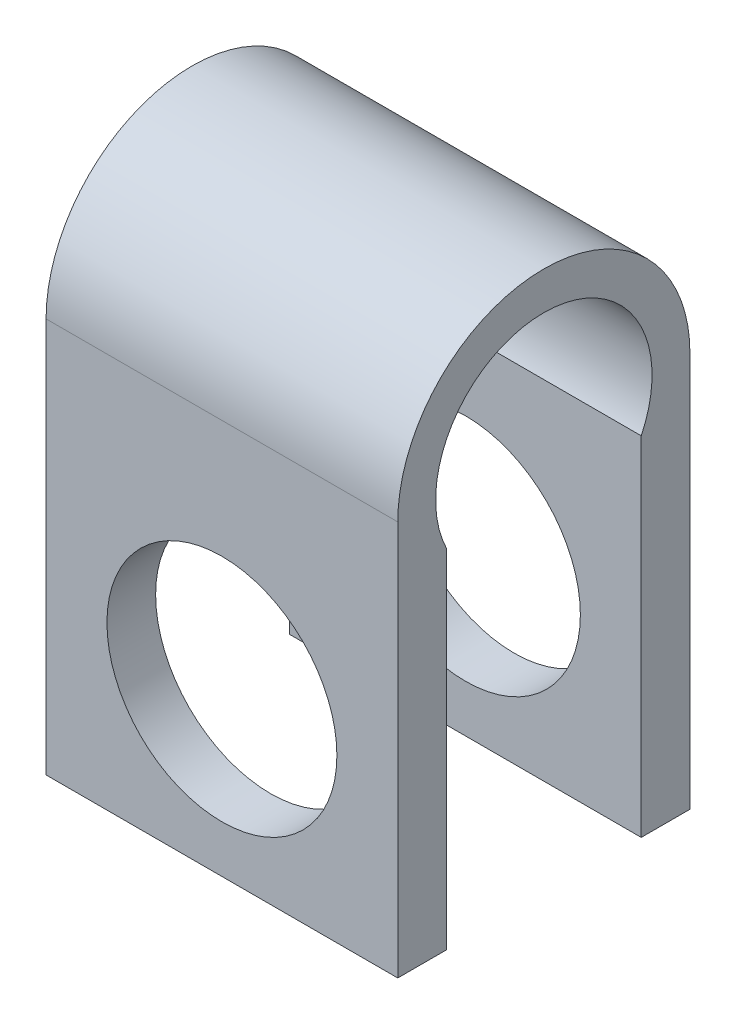
ISO-10303-21;
HEADER;
FILE_DESCRIPTION(('STEP AP214'),'2;1');
FILE_NAME('part.step','',(''),(''),'','','');
FILE_SCHEMA(('AUTOMOTIVE_DESIGN { 1 0 10303 214 1 1 1 1 }'));
ENDSEC;
DATA;
#1=APPLICATION_CONTEXT('core data for automotive mechanical design processes');
#2=APPLICATION_PROTOCOL_DEFINITION('international standard','automotive_design',2000,#1);
#3=PRODUCT_CONTEXT('',#1,'mechanical');
#4=PRODUCT('Part','Part','',(#3));
#5=PRODUCT_RELATED_PRODUCT_CATEGORY('part','',(#4));
#6=PRODUCT_DEFINITION_FORMATION('','',#4);
#7=PRODUCT_DEFINITION_CONTEXT('part definition',#1,'design');
#8=PRODUCT_DEFINITION('design','',#6,#7);
#9=PRODUCT_DEFINITION_SHAPE('','',#8);
#10=(LENGTH_UNIT() NAMED_UNIT(*) SI_UNIT(.MILLI.,.METRE.));
#11=(NAMED_UNIT(*) PLANE_ANGLE_UNIT() SI_UNIT($,.RADIAN.));
#12=(NAMED_UNIT(*) SI_UNIT($,.STERADIAN.) SOLID_ANGLE_UNIT());
#13=UNCERTAINTY_MEASURE_WITH_UNIT(LENGTH_MEASURE(1.E-05),#10,'distance_accuracy_value','');
#14=(GEOMETRIC_REPRESENTATION_CONTEXT(3) GLOBAL_UNCERTAINTY_ASSIGNED_CONTEXT((#13)) GLOBAL_UNIT_ASSIGNED_CONTEXT((#10,
#11,#12)) REPRESENTATION_CONTEXT('',''));
#15=CARTESIAN_POINT('',(0.,0.,0.));
#16=DIRECTION('',(0.,0.,1.));
#17=DIRECTION('',(1.,0.,0.));
#18=AXIS2_PLACEMENT_3D('',#15,#16,#17);
#19=CARTESIAN_POINT('',(13.,0.,0.));
#20=DIRECTION('',(-1.,0.,0.));
#21=DIRECTION('',(0.,0.,1.));
#22=AXIS2_PLACEMENT_3D('',#19,#20,#21);
#23=CYLINDRICAL_SURFACE('',#22,4.);
#24=CARTESIAN_POINT('',(0.,0.,0.));
#25=DIRECTION('',(-1.,0.,0.));
#26=DIRECTION('',(0.,0.,-1.));
#27=AXIS2_PLACEMENT_3D('',#24,#25,#26);
#28=CIRCLE('',#27,4.);
#29=CARTESIAN_POINT('',(0.,-1.74355957741618,3.60000000000004));
#30=VERTEX_POINT('',#29);
#31=CARTESIAN_POINT('',(0.,-1.74355957741618,-3.60000000000004));
#32=VERTEX_POINT('',#31);
#33=EDGE_CURVE('E130',#30,#32,#28,.T.);
#34=ORIENTED_EDGE('',*,*,#33,.T.);
#35=DIRECTION('',(-1.,0.,0.));
#36=VECTOR('',#35,1.);
#37=CARTESIAN_POINT('',(13.,-1.74355957741618,-3.60000000000004));
#38=LINE('',#37,#36);
#39=CARTESIAN_POINT('',(13.,-1.74355957741618,-3.60000000000004));
#40=VERTEX_POINT('',#39);
#41=EDGE_CURVE('E11',#40,#32,#38,.T.);
#42=ORIENTED_EDGE('',*,*,#41,.F.);
#43=CARTESIAN_POINT('',(13.,0.,0.));
#44=DIRECTION('',(-1.,0.,0.));
#45=DIRECTION('',(0.,0.,-1.));
#46=AXIS2_PLACEMENT_3D('',#43,#44,#45);
#47=CIRCLE('',#46,4.);
#48=CARTESIAN_POINT('',(13.,-1.74355957741618,3.60000000000004));
#49=VERTEX_POINT('',#48);
#50=EDGE_CURVE('E145',#49,#40,#47,.T.);
#51=ORIENTED_EDGE('',*,*,#50,.F.);
#52=DIRECTION('',(-1.,0.,0.));
#53=VECTOR('',#52,1.);
#54=CARTESIAN_POINT('',(13.,-1.74355957741618,3.60000000000004));
#55=LINE('',#54,#53);
#56=EDGE_CURVE('E126',#49,#30,#55,.T.);
#57=ORIENTED_EDGE('',*,*,#56,.T.);
#58=EDGE_LOOP('',(#34,#42,#51,#57));
#59=FACE_BOUND('',#58,.T.);
#60=ADVANCED_FACE('F33',(#59),#23,.F.);
#61=CARTESIAN_POINT('',(13.,-14.6,-3.6));
#62=DIRECTION('',(0.,0.,-1.));
#63=DIRECTION('',(0.,1.,0.));
#64=AXIS2_PLACEMENT_3D('',#61,#62,#63);
#65=PLANE('',#64);
#66=CARTESIAN_POINT('',(6.5,-8.59999999999999,-3.60000000000002));
#67=DIRECTION('',(0.,0.,-1.));
#68=DIRECTION('',(0.,1.,0.));
#69=AXIS2_PLACEMENT_3D('',#66,#67,#68);
#70=CIRCLE('',#69,4.25);
#71=CARTESIAN_POINT('',(10.75,-8.59999999999999,-3.60000000000002));
#72=VERTEX_POINT('',#71);
#73=EDGE_CURVE('E134',#72,#72,#70,.T.);
#74=ORIENTED_EDGE('',*,*,#73,.T.);
#75=EDGE_LOOP('',(#74));
#76=FACE_BOUND('',#75,.T.);
#77=DIRECTION('',(0.,-1.,0.));
#78=VECTOR('',#77,1.);
#79=CARTESIAN_POINT('',(0.,-14.6,-3.6));
#80=LINE('',#79,#78);
#81=CARTESIAN_POINT('',(0.,-14.6,-3.6));
#82=VERTEX_POINT('',#81);
#83=EDGE_CURVE('E133',#32,#82,#80,.T.);
#84=ORIENTED_EDGE('',*,*,#83,.T.);
#85=DIRECTION('',(-1.,0.,0.));
#86=VECTOR('',#85,1.);
#87=CARTESIAN_POINT('',(13.,-14.6,-3.6));
#88=LINE('',#87,#86);
#89=CARTESIAN_POINT('',(13.,-14.6,-3.6));
#90=VERTEX_POINT('',#89);
#91=EDGE_CURVE('E42',#90,#82,#88,.T.);
#92=ORIENTED_EDGE('',*,*,#91,.F.);
#93=DIRECTION('',(0.,-1.,0.));
#94=VECTOR('',#93,1.);
#95=CARTESIAN_POINT('',(13.,-14.6,-3.6));
#96=LINE('',#95,#94);
#97=EDGE_CURVE('E93',#40,#90,#96,.T.);
#98=ORIENTED_EDGE('',*,*,#97,.F.);
#99=ORIENTED_EDGE('',*,*,#41,.T.);
#100=EDGE_LOOP('',(#84,#92,#98,#99));
#101=FACE_BOUND('',#100,.T.);
#102=ADVANCED_FACE('F206',(#76,#101),#65,.F.);
#103=CARTESIAN_POINT('',(13.,-14.6,-5.4));
#104=DIRECTION('',(0.,1.,0.));
#105=DIRECTION('',(0.,0.,1.));
#106=AXIS2_PLACEMENT_3D('',#103,#104,#105);
#107=PLANE('',#106);
#108=DIRECTION('',(0.,0.,-1.));
#109=VECTOR('',#108,1.);
#110=CARTESIAN_POINT('',(0.,-14.6,-5.4));
#111=LINE('',#110,#109);
#112=CARTESIAN_POINT('',(0.,-14.6,-5.4));
#113=VERTEX_POINT('',#112);
#114=EDGE_CURVE('E136',#82,#113,#111,.T.);
#115=ORIENTED_EDGE('',*,*,#114,.T.);
#116=DIRECTION('',(-1.,0.,0.));
#117=VECTOR('',#116,1.);
#118=CARTESIAN_POINT('',(13.,-14.6,-5.4));
#119=LINE('',#118,#117);
#120=CARTESIAN_POINT('',(13.,-14.6,-5.4));
#121=VERTEX_POINT('',#120);
#122=EDGE_CURVE('E152',#121,#113,#119,.T.);
#123=ORIENTED_EDGE('',*,*,#122,.F.);
#124=DIRECTION('',(0.,0.,-1.));
#125=VECTOR('',#124,1.);
#126=CARTESIAN_POINT('',(13.,-14.6,-5.4));
#127=LINE('',#126,#125);
#128=EDGE_CURVE('E161',#90,#121,#127,.T.);
#129=ORIENTED_EDGE('',*,*,#128,.F.);
#130=ORIENTED_EDGE('',*,*,#91,.T.);
#131=EDGE_LOOP('',(#115,#123,#129,#130));
#132=FACE_BOUND('',#131,.T.);
#133=ADVANCED_FACE('F159',(#132),#107,.F.);
#134=CARTESIAN_POINT('',(13.,0.,-5.4));
#135=DIRECTION('',(0.,0.,1.));
#136=DIRECTION('',(0.,-1.,0.));
#137=AXIS2_PLACEMENT_3D('',#134,#135,#136);
#138=PLANE('',#137);
#139=CARTESIAN_POINT('',(6.5,-8.59999999999999,-5.4));
#140=DIRECTION('',(0.,0.,1.));
#141=DIRECTION('',(1.,0.,0.));
#142=AXIS2_PLACEMENT_3D('',#139,#140,#141);
#143=CIRCLE('',#142,4.25);
#144=CARTESIAN_POINT('',(10.75,-8.59999999999999,-5.4));
#145=VERTEX_POINT('',#144);
#146=EDGE_CURVE('E184',#145,#145,#143,.T.);
#147=ORIENTED_EDGE('',*,*,#146,.T.);
#148=EDGE_LOOP('',(#147));
#149=FACE_BOUND('',#148,.T.);
#150=DIRECTION('',(0.,1.,0.));
#151=VECTOR('',#150,1.);
#152=CARTESIAN_POINT('',(0.,0.,-5.4));
#153=LINE('',#152,#151);
#154=CARTESIAN_POINT('',(0.,0.,-5.4));
#155=VERTEX_POINT('',#154);
#156=EDGE_CURVE('E138',#113,#155,#153,.T.);
#157=ORIENTED_EDGE('',*,*,#156,.T.);
#158=DIRECTION('',(-1.,0.,0.));
#159=VECTOR('',#158,1.);
#160=CARTESIAN_POINT('',(13.,0.,-5.4));
#161=LINE('',#160,#159);
#162=CARTESIAN_POINT('',(13.,0.,-5.4));
#163=VERTEX_POINT('',#162);
#164=EDGE_CURVE('E149',#163,#155,#161,.T.);
#165=ORIENTED_EDGE('',*,*,#164,.F.);
#166=DIRECTION('',(0.,1.,0.));
#167=VECTOR('',#166,1.);
#168=CARTESIAN_POINT('',(13.,0.,-5.4));
#169=LINE('',#168,#167);
#170=EDGE_CURVE('E173',#121,#163,#169,.T.);
#171=ORIENTED_EDGE('',*,*,#170,.F.);
#172=ORIENTED_EDGE('',*,*,#122,.T.);
#173=EDGE_LOOP('',(#157,#165,#171,#172));
#174=FACE_BOUND('',#173,.T.);
#175=ADVANCED_FACE('F169',(#149,#174),#138,.F.);
#176=CARTESIAN_POINT('',(13.,0.,0.));
#177=DIRECTION('',(-1.,0.,0.));
#178=DIRECTION('',(0.,0.,1.));
#179=AXIS2_PLACEMENT_3D('',#176,#177,#178);
#180=CYLINDRICAL_SURFACE('',#179,5.4);
#181=CARTESIAN_POINT('',(0.,0.,0.));
#182=DIRECTION('',(1.,0.,0.));
#183=DIRECTION('',(0.,0.,-1.));
#184=AXIS2_PLACEMENT_3D('',#181,#182,#183);
#185=CIRCLE('',#184,5.4);
#186=CARTESIAN_POINT('',(0.,0.,5.4));
#187=VERTEX_POINT('',#186);
#188=EDGE_CURVE('E140',#155,#187,#185,.T.);
#189=ORIENTED_EDGE('',*,*,#188,.T.);
#190=DIRECTION('',(-1.,0.,0.));
#191=VECTOR('',#190,1.);
#192=CARTESIAN_POINT('',(13.,0.,5.4));
#193=LINE('',#192,#191);
#194=CARTESIAN_POINT('',(13.,0.,5.4));
#195=VERTEX_POINT('',#194);
#196=EDGE_CURVE('E121',#195,#187,#193,.T.);
#197=ORIENTED_EDGE('',*,*,#196,.F.);
#198=CARTESIAN_POINT('',(13.,0.,0.));
#199=DIRECTION('',(1.,0.,0.));
#200=DIRECTION('',(0.,0.,-1.));
#201=AXIS2_PLACEMENT_3D('',#198,#199,#200);
#202=CIRCLE('',#201,5.4);
#203=EDGE_CURVE('E112',#163,#195,#202,.T.);
#204=ORIENTED_EDGE('',*,*,#203,.F.);
#205=ORIENTED_EDGE('',*,*,#164,.T.);
#206=EDGE_LOOP('',(#189,#197,#204,#205));
#207=FACE_BOUND('',#206,.T.);
#208=ADVANCED_FACE('F172',(#207),#180,.T.);
#209=CARTESIAN_POINT('',(13.,0.,5.4));
#210=DIRECTION('',(0.,0.,-1.));
#211=DIRECTION('',(0.,1.,0.));
#212=AXIS2_PLACEMENT_3D('',#209,#210,#211);
#213=PLANE('',#212);
#214=CARTESIAN_POINT('',(6.5,-8.59999999999999,5.4));
#215=DIRECTION('',(0.,0.,1.));
#216=DIRECTION('',(1.,0.,0.));
#217=AXIS2_PLACEMENT_3D('',#214,#215,#216);
#218=CIRCLE('',#217,4.25);
#219=CARTESIAN_POINT('',(10.75,-8.59999999999999,5.4));
#220=VERTEX_POINT('',#219);
#221=EDGE_CURVE('E181',#220,#220,#218,.T.);
#222=ORIENTED_EDGE('',*,*,#221,.F.);
#223=EDGE_LOOP('',(#222));
#224=FACE_BOUND('',#223,.T.);
#225=DIRECTION('',(0.,-1.,0.));
#226=VECTOR('',#225,1.);
#227=CARTESIAN_POINT('',(0.,0.,5.4));
#228=LINE('',#227,#226);
#229=CARTESIAN_POINT('',(0.,-14.6,5.4));
#230=VERTEX_POINT('',#229);
#231=EDGE_CURVE('E120',#187,#230,#228,.T.);
#232=ORIENTED_EDGE('',*,*,#231,.T.);
#233=DIRECTION('',(-1.,0.,0.));
#234=VECTOR('',#233,1.);
#235=CARTESIAN_POINT('',(13.,-14.6,5.4));
#236=LINE('',#235,#234);
#237=CARTESIAN_POINT('',(13.,-14.6,5.4));
#238=VERTEX_POINT('',#237);
#239=EDGE_CURVE('E117',#238,#230,#236,.T.);
#240=ORIENTED_EDGE('',*,*,#239,.F.);
#241=DIRECTION('',(0.,-1.,0.));
#242=VECTOR('',#241,1.);
#243=CARTESIAN_POINT('',(13.,0.,5.4));
#244=LINE('',#243,#242);
#245=EDGE_CURVE('E106',#195,#238,#244,.T.);
#246=ORIENTED_EDGE('',*,*,#245,.F.);
#247=ORIENTED_EDGE('',*,*,#196,.T.);
#248=EDGE_LOOP('',(#232,#240,#246,#247));
#249=FACE_BOUND('',#248,.T.);
#250=ADVANCED_FACE('F118',(#224,#249),#213,.F.);
#251=CARTESIAN_POINT('',(13.,-14.6,5.4));
#252=DIRECTION('',(0.,1.,0.));
#253=DIRECTION('',(0.,0.,1.));
#254=AXIS2_PLACEMENT_3D('',#251,#252,#253);
#255=PLANE('',#254);
#256=DIRECTION('',(0.,0.,-1.));
#257=VECTOR('',#256,1.);
#258=CARTESIAN_POINT('',(0.,-14.6,5.4));
#259=LINE('',#258,#257);
#260=CARTESIAN_POINT('',(0.,-14.6,3.6));
#261=VERTEX_POINT('',#260);
#262=EDGE_CURVE('E79',#230,#261,#259,.T.);
#263=ORIENTED_EDGE('',*,*,#262,.T.);
#264=DIRECTION('',(-1.,0.,0.));
#265=VECTOR('',#264,1.);
#266=CARTESIAN_POINT('',(13.,-14.6,3.6));
#267=LINE('',#266,#265);
#268=CARTESIAN_POINT('',(13.,-14.6,3.6));
#269=VERTEX_POINT('',#268);
#270=EDGE_CURVE('E122',#269,#261,#267,.T.);
#271=ORIENTED_EDGE('',*,*,#270,.F.);
#272=DIRECTION('',(0.,0.,-1.));
#273=VECTOR('',#272,1.);
#274=CARTESIAN_POINT('',(13.,-14.6,5.4));
#275=LINE('',#274,#273);
#276=EDGE_CURVE('E110',#238,#269,#275,.T.);
#277=ORIENTED_EDGE('',*,*,#276,.F.);
#278=ORIENTED_EDGE('',*,*,#239,.T.);
#279=EDGE_LOOP('',(#263,#271,#277,#278));
#280=FACE_BOUND('',#279,.T.);
#281=ADVANCED_FACE('F124',(#280),#255,.F.);
#282=CARTESIAN_POINT('',(13.,-14.6,3.6));
#283=DIRECTION('',(0.,0.,1.));
#284=DIRECTION('',(0.,-1.,0.));
#285=AXIS2_PLACEMENT_3D('',#282,#283,#284);
#286=PLANE('',#285);
#287=CARTESIAN_POINT('',(6.5,-8.59999999999999,3.60000000000002));
#288=DIRECTION('',(0.,0.,1.));
#289=DIRECTION('',(0.,-1.,0.));
#290=AXIS2_PLACEMENT_3D('',#287,#288,#289);
#291=CIRCLE('',#290,4.25);
#292=CARTESIAN_POINT('',(10.75,-8.59999999999999,3.60000000000002));
#293=VERTEX_POINT('',#292);
#294=EDGE_CURVE('E36',#293,#293,#291,.T.);
#295=ORIENTED_EDGE('',*,*,#294,.T.);
#296=EDGE_LOOP('',(#295));
#297=FACE_BOUND('',#296,.T.);
#298=DIRECTION('',(0.,1.,0.));
#299=VECTOR('',#298,1.);
#300=CARTESIAN_POINT('',(0.,-14.6,3.6));
#301=LINE('',#300,#299);
#302=EDGE_CURVE('E85',#261,#30,#301,.T.);
#303=ORIENTED_EDGE('',*,*,#302,.T.);
#304=ORIENTED_EDGE('',*,*,#56,.F.);
#305=DIRECTION('',(0.,1.,0.));
#306=VECTOR('',#305,1.);
#307=CARTESIAN_POINT('',(13.,-14.6,3.6));
#308=LINE('',#307,#306);
#309=EDGE_CURVE('E50',#269,#49,#308,.T.);
#310=ORIENTED_EDGE('',*,*,#309,.F.);
#311=ORIENTED_EDGE('',*,*,#270,.T.);
#312=EDGE_LOOP('',(#303,#304,#310,#311));
#313=FACE_BOUND('',#312,.T.);
#314=ADVANCED_FACE('F191',(#297,#313),#286,.F.);
#315=CARTESIAN_POINT('',(13.,0.,0.));
#316=DIRECTION('',(1.,0.,0.));
#317=DIRECTION('',(0.,0.,-1.));
#318=AXIS2_PLACEMENT_3D('',#315,#316,#317);
#319=PLANE('',#318);
#320=ORIENTED_EDGE('',*,*,#50,.T.);
#321=ORIENTED_EDGE('',*,*,#97,.T.);
#322=ORIENTED_EDGE('',*,*,#128,.T.);
#323=ORIENTED_EDGE('',*,*,#170,.T.);
#324=ORIENTED_EDGE('',*,*,#203,.T.);
#325=ORIENTED_EDGE('',*,*,#245,.T.);
#326=ORIENTED_EDGE('',*,*,#276,.T.);
#327=ORIENTED_EDGE('',*,*,#309,.T.);
#328=EDGE_LOOP('',(#320,#321,#322,#323,#324,#325,#326,#327));
#329=FACE_BOUND('',#328,.T.);
#330=ADVANCED_FACE('F108',(#329),#319,.T.);
#331=CARTESIAN_POINT('',(0.,0.,0.));
#332=DIRECTION('',(1.,0.,0.));
#333=DIRECTION('',(0.,0.,-1.));
#334=AXIS2_PLACEMENT_3D('',#331,#332,#333);
#335=PLANE('',#334);
#336=ORIENTED_EDGE('',*,*,#33,.F.);
#337=ORIENTED_EDGE('',*,*,#302,.F.);
#338=ORIENTED_EDGE('',*,*,#262,.F.);
#339=ORIENTED_EDGE('',*,*,#231,.F.);
#340=ORIENTED_EDGE('',*,*,#188,.F.);
#341=ORIENTED_EDGE('',*,*,#156,.F.);
#342=ORIENTED_EDGE('',*,*,#114,.F.);
#343=ORIENTED_EDGE('',*,*,#83,.F.);
#344=EDGE_LOOP('',(#336,#337,#338,#339,#340,#341,#342,#343));
#345=FACE_BOUND('',#344,.T.);
#346=ADVANCED_FACE('F165',(#345),#335,.F.);
#347=CARTESIAN_POINT('',(6.5,-8.59999999999999,-5.4));
#348=DIRECTION('',(0.,0.,1.));
#349=DIRECTION('',(1.,0.,0.));
#350=AXIS2_PLACEMENT_3D('',#347,#348,#349);
#351=CYLINDRICAL_SURFACE('',#350,4.25);
#352=CARTESIAN_POINT('',(10.75,-8.59999999999999,5.4));
#353=CARTESIAN_POINT('',(10.75,-8.59999999999999,5.38125));
#354=CARTESIAN_POINT('',(10.75,-8.59999999999999,5.3625));
#355=CARTESIAN_POINT('',(10.75,-8.59999999999999,5.325));
#356=CARTESIAN_POINT('',(10.75,-8.59999999999999,5.30625));
#357=CARTESIAN_POINT('',(10.75,-8.59999999999999,5.26875));
#358=CARTESIAN_POINT('',(10.75,-8.59999999999999,5.25));
#359=CARTESIAN_POINT('',(10.75,-8.59999999999999,5.2125));
#360=CARTESIAN_POINT('',(10.75,-8.59999999999999,5.19375));
#361=CARTESIAN_POINT('',(10.75,-8.59999999999999,5.15625));
#362=CARTESIAN_POINT('',(10.75,-8.59999999999999,5.1375));
#363=CARTESIAN_POINT('',(10.75,-8.59999999999999,5.1));
#364=CARTESIAN_POINT('',(10.75,-8.59999999999999,5.08125));
#365=CARTESIAN_POINT('',(10.75,-8.59999999999999,5.04375));
#366=CARTESIAN_POINT('',(10.75,-8.59999999999999,5.025));
#367=CARTESIAN_POINT('',(10.75,-8.59999999999999,4.98750000000001));
#368=CARTESIAN_POINT('',(10.75,-8.59999999999999,4.96875000000001));
#369=CARTESIAN_POINT('',(10.75,-8.59999999999999,4.93125));
#370=CARTESIAN_POINT('',(10.75,-8.59999999999999,4.9125));
#371=CARTESIAN_POINT('',(10.75,-8.59999999999999,4.87500000000001));
#372=CARTESIAN_POINT('',(10.75,-8.59999999999999,4.85625000000001));
#373=CARTESIAN_POINT('',(10.75,-8.59999999999999,4.81875000000001));
#374=CARTESIAN_POINT('',(10.75,-8.59999999999999,4.80000000000001));
#375=CARTESIAN_POINT('',(10.75,-8.59999999999999,4.76250000000001));
#376=CARTESIAN_POINT('',(10.75,-8.59999999999999,4.74375000000001));
#377=CARTESIAN_POINT('',(10.75,-8.59999999999999,4.70625000000001));
#378=CARTESIAN_POINT('',(10.75,-8.59999999999999,4.68750000000001));
#379=CARTESIAN_POINT('',(10.75,-8.59999999999999,4.65000000000001));
#380=CARTESIAN_POINT('',(10.75,-8.59999999999999,4.63125000000001));
#381=CARTESIAN_POINT('',(10.75,-8.59999999999999,4.59375000000001));
#382=CARTESIAN_POINT('',(10.75,-8.59999999999999,4.57500000000001));
#383=CARTESIAN_POINT('',(10.75,-8.59999999999999,4.53750000000001));
#384=CARTESIAN_POINT('',(10.75,-8.59999999999999,4.51875000000001));
#385=CARTESIAN_POINT('',(10.75,-8.59999999999999,4.48125000000001));
#386=CARTESIAN_POINT('',(10.75,-8.59999999999999,4.46250000000001));
#387=CARTESIAN_POINT('',(10.75,-8.59999999999999,4.42500000000001));
#388=CARTESIAN_POINT('',(10.75,-8.59999999999999,4.40625000000001));
#389=CARTESIAN_POINT('',(10.75,-8.59999999999999,4.36875000000001));
#390=CARTESIAN_POINT('',(10.75,-8.59999999999999,4.35000000000001));
#391=CARTESIAN_POINT('',(10.75,-8.59999999999999,4.31250000000001));
#392=CARTESIAN_POINT('',(10.75,-8.59999999999999,4.29375000000001));
#393=CARTESIAN_POINT('',(10.75,-8.59999999999999,4.25625000000001));
#394=CARTESIAN_POINT('',(10.75,-8.59999999999999,4.23750000000001));
#395=CARTESIAN_POINT('',(10.75,-8.59999999999999,4.20000000000001));
#396=CARTESIAN_POINT('',(10.75,-8.59999999999999,4.18125000000001));
#397=CARTESIAN_POINT('',(10.75,-8.59999999999999,4.14375000000002));
#398=CARTESIAN_POINT('',(10.75,-8.59999999999999,4.12500000000002));
#399=CARTESIAN_POINT('',(10.75,-8.59999999999999,4.08750000000002));
#400=CARTESIAN_POINT('',(10.75,-8.59999999999999,4.06875000000002));
#401=CARTESIAN_POINT('',(10.75,-8.59999999999999,4.03125000000002));
#402=CARTESIAN_POINT('',(10.75,-8.59999999999999,4.01250000000002));
#403=CARTESIAN_POINT('',(10.75,-8.59999999999999,3.97500000000002));
#404=CARTESIAN_POINT('',(10.75,-8.59999999999999,3.95625000000002));
#405=CARTESIAN_POINT('',(10.75,-8.59999999999999,3.91875000000002));
#406=CARTESIAN_POINT('',(10.75,-8.59999999999999,3.90000000000002));
#407=CARTESIAN_POINT('',(10.75,-8.59999999999999,3.86250000000002));
#408=CARTESIAN_POINT('',(10.75,-8.59999999999999,3.84375000000002));
#409=CARTESIAN_POINT('',(10.75,-8.59999999999999,3.80625000000002));
#410=CARTESIAN_POINT('',(10.75,-8.59999999999999,3.78750000000002));
#411=CARTESIAN_POINT('',(10.75,-8.59999999999999,3.75000000000002));
#412=CARTESIAN_POINT('',(10.75,-8.59999999999999,3.73125000000002));
#413=CARTESIAN_POINT('',(10.75,-8.59999999999999,3.69375000000002));
#414=CARTESIAN_POINT('',(10.75,-8.59999999999999,3.67500000000002));
#415=CARTESIAN_POINT('',(10.75,-8.59999999999999,3.63750000000002));
#416=CARTESIAN_POINT('',(10.75,-8.59999999999999,3.61875000000002));
#417=CARTESIAN_POINT('',(10.75,-8.59999999999999,3.60000000000002));
#418=B_SPLINE_CURVE_WITH_KNOTS('',3,(#352,#353,#354,#355,#356,#357,#358,#359,#360,#361,#362,
#363,#364,#365,#366,#367,#368,#369,#370,#371,#372,#373,#374,#375,#376,#377,#378,#379,#380,#381,
#382,#383,#384,#385,#386,#387,#388,#389,#390,#391,#392,#393,#394,#395,#396,#397,#398,#399,#400,
#401,#402,#403,#404,#405,#406,#407,#408,#409,#410,#411,#412,#413,#414,#415,#416,#417),
.UNSPECIFIED.,.F.,.F.,(4,2,2,2,2,2,2,2,2,2,2,2,2,2,2,2,2,2,2,2,2,2,2,2,2,2,2,2,2,2,2,2,4),(0.,
0.056249999999999,0.112499999999998,0.168749999999999,0.224999999999998,0.281249999999997,
0.337499999999996,0.393749999999995,0.449999999999996,0.506249999999995,0.562499999999994,
0.618749999999993,0.674999999999992,0.731249999999991,0.787499999999991,0.84374999999999,
0.899999999999989,0.956249999999988,1.01249999999999,1.06874999999999,1.12499999999999,
1.18124999999999,1.23749999999999,1.29374999999998,1.34999999999998,1.40624999999998,
1.46249999999998,1.51874999999998,1.57499999999998,1.63124999999998,1.68749999999998,
1.74374999999998,1.79999999999998),.UNSPECIFIED.);
#419=EDGE_CURVE('BSEAM193',#220,#293,#418,.T.);
#420=ORIENTED_EDGE('',*,*,#221,.T.);
#421=ORIENTED_EDGE('',*,*,#294,.F.);
#422=ORIENTED_EDGE('',*,*,#419,.T.);
#423=ORIENTED_EDGE('',*,*,#419,.F.);
#424=EDGE_LOOP('',(#420,#422,#421,#423));
#425=FACE_BOUND('',#424,.T.);
#426=ADVANCED_FACE('F193',(#425),#351,.F.);
#427=CARTESIAN_POINT('',(10.75,-8.59999999999999,-5.4));
#428=CARTESIAN_POINT('',(10.75,-8.59999999999999,-5.38125));
#429=CARTESIAN_POINT('',(10.75,-8.59999999999999,-5.3625));
#430=CARTESIAN_POINT('',(10.75,-8.59999999999999,-5.325));
#431=CARTESIAN_POINT('',(10.75,-8.59999999999999,-5.30625));
#432=CARTESIAN_POINT('',(10.75,-8.59999999999999,-5.26875));
#433=CARTESIAN_POINT('',(10.75,-8.59999999999999,-5.25));
#434=CARTESIAN_POINT('',(10.75,-8.59999999999999,-5.2125));
#435=CARTESIAN_POINT('',(10.75,-8.59999999999999,-5.19375));
#436=CARTESIAN_POINT('',(10.75,-8.59999999999999,-5.15625000000001));
#437=CARTESIAN_POINT('',(10.75,-8.59999999999999,-5.1375));
#438=CARTESIAN_POINT('',(10.75,-8.59999999999999,-5.10000000000001));
#439=CARTESIAN_POINT('',(10.75,-8.59999999999999,-5.08125000000001));
#440=CARTESIAN_POINT('',(10.75,-8.59999999999999,-5.04375000000001));
#441=CARTESIAN_POINT('',(10.75,-8.59999999999999,-5.02500000000001));
#442=CARTESIAN_POINT('',(10.75,-8.59999999999999,-4.98750000000001));
#443=CARTESIAN_POINT('',(10.75,-8.59999999999999,-4.96875000000001));
#444=CARTESIAN_POINT('',(10.75,-8.59999999999999,-4.93125000000001));
#445=CARTESIAN_POINT('',(10.75,-8.59999999999999,-4.91250000000001));
#446=CARTESIAN_POINT('',(10.75,-8.59999999999999,-4.87500000000001));
#447=CARTESIAN_POINT('',(10.75,-8.59999999999999,-4.85625000000001));
#448=CARTESIAN_POINT('',(10.75,-8.59999999999999,-4.81875000000001));
#449=CARTESIAN_POINT('',(10.75,-8.59999999999999,-4.80000000000001));
#450=CARTESIAN_POINT('',(10.75,-8.59999999999999,-4.76250000000001));
#451=CARTESIAN_POINT('',(10.75,-8.59999999999999,-4.74375000000001));
#452=CARTESIAN_POINT('',(10.75,-8.59999999999999,-4.70625000000001));
#453=CARTESIAN_POINT('',(10.75,-8.59999999999999,-4.68750000000001));
#454=CARTESIAN_POINT('',(10.75,-8.59999999999999,-4.65000000000001));
#455=CARTESIAN_POINT('',(10.75,-8.59999999999999,-4.63125000000001));
#456=CARTESIAN_POINT('',(10.75,-8.59999999999999,-4.59375000000001));
#457=CARTESIAN_POINT('',(10.75,-8.59999999999999,-4.57500000000001));
#458=CARTESIAN_POINT('',(10.75,-8.59999999999999,-4.53750000000001));
#459=CARTESIAN_POINT('',(10.75,-8.59999999999999,-4.51875000000001));
#460=CARTESIAN_POINT('',(10.75,-8.59999999999999,-4.48125000000001));
#461=CARTESIAN_POINT('',(10.75,-8.59999999999999,-4.46250000000001));
#462=CARTESIAN_POINT('',(10.75,-8.59999999999999,-4.42500000000001));
#463=CARTESIAN_POINT('',(10.75,-8.59999999999999,-4.40625000000001));
#464=CARTESIAN_POINT('',(10.75,-8.59999999999999,-4.36875000000001));
#465=CARTESIAN_POINT('',(10.75,-8.59999999999999,-4.35000000000001));
#466=CARTESIAN_POINT('',(10.75,-8.59999999999999,-4.31250000000001));
#467=CARTESIAN_POINT('',(10.75,-8.59999999999999,-4.29375000000001));
#468=CARTESIAN_POINT('',(10.75,-8.59999999999999,-4.25625000000002));
#469=CARTESIAN_POINT('',(10.75,-8.59999999999999,-4.23750000000001));
#470=CARTESIAN_POINT('',(10.75,-8.59999999999999,-4.20000000000002));
#471=CARTESIAN_POINT('',(10.75,-8.59999999999999,-4.18125000000002));
#472=CARTESIAN_POINT('',(10.75,-8.59999999999999,-4.14375000000002));
#473=CARTESIAN_POINT('',(10.75,-8.59999999999999,-4.12500000000002));
#474=CARTESIAN_POINT('',(10.75,-8.59999999999999,-4.08750000000002));
#475=CARTESIAN_POINT('',(10.75,-8.59999999999999,-4.06875000000002));
#476=CARTESIAN_POINT('',(10.75,-8.59999999999999,-4.03125000000002));
#477=CARTESIAN_POINT('',(10.75,-8.59999999999999,-4.01250000000002));
#478=CARTESIAN_POINT('',(10.75,-8.59999999999999,-3.97500000000002));
#479=CARTESIAN_POINT('',(10.75,-8.59999999999999,-3.95625000000002));
#480=CARTESIAN_POINT('',(10.75,-8.59999999999999,-3.91875000000002));
#481=CARTESIAN_POINT('',(10.75,-8.59999999999999,-3.90000000000002));
#482=CARTESIAN_POINT('',(10.75,-8.59999999999999,-3.86250000000002));
#483=CARTESIAN_POINT('',(10.75,-8.59999999999999,-3.84375000000002));
#484=CARTESIAN_POINT('',(10.75,-8.59999999999999,-3.80625000000002));
#485=CARTESIAN_POINT('',(10.75,-8.59999999999999,-3.78750000000002));
#486=CARTESIAN_POINT('',(10.75,-8.59999999999999,-3.75000000000002));
#487=CARTESIAN_POINT('',(10.75,-8.59999999999999,-3.73125000000002));
#488=CARTESIAN_POINT('',(10.75,-8.59999999999999,-3.69375000000002));
#489=CARTESIAN_POINT('',(10.75,-8.59999999999999,-3.67500000000002));
#490=CARTESIAN_POINT('',(10.75,-8.59999999999999,-3.63750000000002));
#491=CARTESIAN_POINT('',(10.75,-8.59999999999999,-3.61875000000002));
#492=CARTESIAN_POINT('',(10.75,-8.59999999999999,-3.60000000000002));
#493=B_SPLINE_CURVE_WITH_KNOTS('',3,(#427,#428,#429,#430,#431,#432,#433,#434,#435,#436,#437,
#438,#439,#440,#441,#442,#443,#444,#445,#446,#447,#448,#449,#450,#451,#452,#453,#454,#455,#456,
#457,#458,#459,#460,#461,#462,#463,#464,#465,#466,#467,#468,#469,#470,#471,#472,#473,#474,#475,
#476,#477,#478,#479,#480,#481,#482,#483,#484,#485,#486,#487,#488,#489,#490,#491,#492),
.UNSPECIFIED.,.F.,.F.,(4,2,2,2,2,2,2,2,2,2,2,2,2,2,2,2,2,2,2,2,2,2,2,2,2,2,2,2,2,2,2,2,4),(0.,
0.056249999999999,0.112499999999998,0.168749999999998,0.224999999999997,0.281249999999997,
0.337499999999996,0.393749999999996,0.449999999999995,0.506249999999995,0.562499999999994,
0.618749999999993,0.674999999999992,0.731249999999991,0.787499999999991,0.84374999999999,
0.89999999999999,0.956249999999989,1.01249999999999,1.06874999999999,1.12499999999999,
1.18124999999999,1.23749999999999,1.29374999999999,1.34999999999998,1.40624999999998,
1.46249999999998,1.51874999999998,1.57499999999998,1.63124999999998,1.68749999999998,
1.74374999999998,1.79999999999998),.UNSPECIFIED.);
#494=EDGE_CURVE('BSEAM195',#145,#72,#493,.T.);
#495=ORIENTED_EDGE('',*,*,#146,.F.);
#496=ORIENTED_EDGE('',*,*,#73,.F.);
#497=ORIENTED_EDGE('',*,*,#494,.T.);
#498=ORIENTED_EDGE('',*,*,#494,.F.);
#499=EDGE_LOOP('',(#495,#497,#496,#498));
#500=FACE_BOUND('',#499,.T.);
#501=ADVANCED_FACE('F195',(#500),#351,.F.);
#502=CLOSED_SHELL('',(#60,#102,#133,#175,#208,#250,#281,#314,#330,#346,#426,#501));
#503=MANIFOLD_SOLID_BREP('B2',#502);
#504=ADVANCED_BREP_SHAPE_REPRESENTATION('',(#18,#503),#14);
#505=SHAPE_DEFINITION_REPRESENTATION(#9,#504);
ENDSEC;
END-ISO-10303-21;
